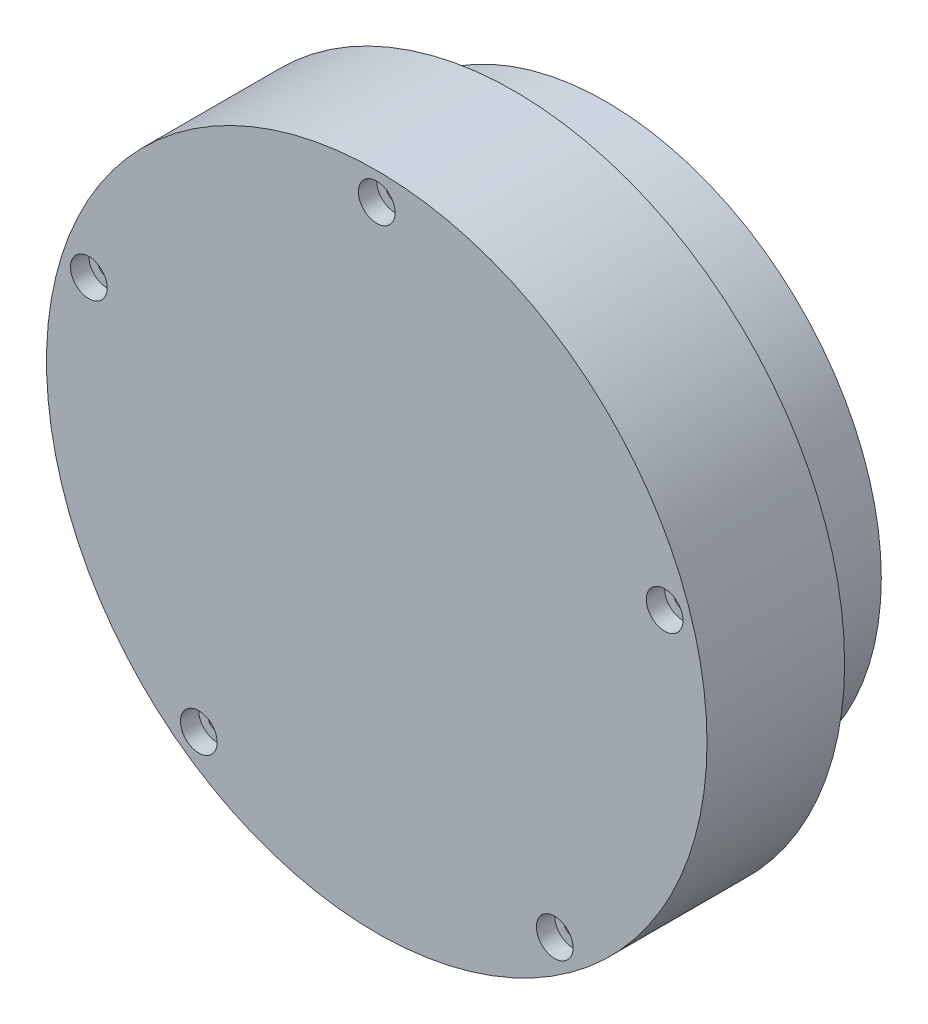
ISO-10303-21;
HEADER;
FILE_DESCRIPTION(('STEP AP214'),'2;1');
FILE_NAME('part.step','',(''),(''),'','','');
FILE_SCHEMA(('AUTOMOTIVE_DESIGN { 1 0 10303 214 1 1 1 1 }'));
ENDSEC;
DATA;
#1=APPLICATION_CONTEXT('core data for automotive mechanical design processes');
#2=APPLICATION_PROTOCOL_DEFINITION('international standard','automotive_design',2000,#1);
#3=PRODUCT_CONTEXT('',#1,'mechanical');
#4=PRODUCT('Part','Part','',(#3));
#5=PRODUCT_RELATED_PRODUCT_CATEGORY('part','',(#4));
#6=PRODUCT_DEFINITION_FORMATION('','',#4);
#7=PRODUCT_DEFINITION_CONTEXT('part definition',#1,'design');
#8=PRODUCT_DEFINITION('design','',#6,#7);
#9=PRODUCT_DEFINITION_SHAPE('','',#8);
#10=(LENGTH_UNIT() NAMED_UNIT(*) SI_UNIT(.MILLI.,.METRE.));
#11=(NAMED_UNIT(*) PLANE_ANGLE_UNIT() SI_UNIT($,.RADIAN.));
#12=(NAMED_UNIT(*) SI_UNIT($,.STERADIAN.) SOLID_ANGLE_UNIT());
#13=UNCERTAINTY_MEASURE_WITH_UNIT(LENGTH_MEASURE(1.E-05),#10,'distance_accuracy_value','');
#14=(GEOMETRIC_REPRESENTATION_CONTEXT(3) GLOBAL_UNCERTAINTY_ASSIGNED_CONTEXT((#13)) GLOBAL_UNIT_ASSIGNED_CONTEXT((#10,
#11,#12)) REPRESENTATION_CONTEXT('',''));
#15=CARTESIAN_POINT('',(0.,0.,0.));
#16=DIRECTION('',(0.,0.,1.));
#17=DIRECTION('',(1.,0.,0.));
#18=AXIS2_PLACEMENT_3D('',#15,#16,#17);
#19=CARTESIAN_POINT('',(0.,41.91,5.94045602605863));
#20=DIRECTION('',(0.,0.,1.));
#21=DIRECTION('',(1.,0.,0.));
#22=AXIS2_PLACEMENT_3D('',#19,#20,#21);
#23=CYLINDRICAL_SURFACE('',#22,1.27);
#24=CARTESIAN_POINT('',(0.,41.91,14.8304560260586));
#25=DIRECTION('',(0.,0.,-1.));
#26=DIRECTION('',(-1.,0.,0.));
#27=AXIS2_PLACEMENT_3D('',#24,#25,#26);
#28=CIRCLE('',#27,1.27);
#29=CARTESIAN_POINT('',(-1.27,41.91,14.8304560260586));
#30=VERTEX_POINT('',#29);
#31=EDGE_CURVE('E52',#30,#30,#28,.T.);
#32=ORIENTED_EDGE('',*,*,#31,.T.);
#33=EDGE_LOOP('',(#32));
#34=FACE_BOUND('',#33,.T.);
#35=CARTESIAN_POINT('',(0.,41.91,31.3404560260586));
#36=DIRECTION('',(0.,0.,1.));
#37=DIRECTION('',(1.,0.,0.));
#38=AXIS2_PLACEMENT_3D('',#35,#36,#37);
#39=CIRCLE('',#38,1.27);
#40=CARTESIAN_POINT('',(1.27,41.91,31.3404560260586));
#41=VERTEX_POINT('',#40);
#42=EDGE_CURVE('E41',#41,#41,#39,.F.);
#43=ORIENTED_EDGE('',*,*,#42,.F.);
#44=EDGE_LOOP('',(#43));
#45=FACE_BOUND('',#44,.T.);
#46=ADVANCED_FACE('F40',(#34,#45),#23,.F.);
#47=CARTESIAN_POINT('',(0.,0.,33.8804560260586));
#48=DIRECTION('',(0.,0.,1.));
#49=DIRECTION('',(1.,0.,0.));
#50=AXIS2_PLACEMENT_3D('',#47,#48,#49);
#51=PLANE('',#50);
#52=CARTESIAN_POINT('',(-39.8587785979299,12.9509022342539,33.8804560260586));
#53=DIRECTION('',(0.,0.,1.));
#54=DIRECTION('',(0.309016994374945,0.951056516295155,0.));
#55=AXIS2_PLACEMENT_3D('',#52,#53,#54);
#56=CIRCLE('',#55,2.54);
#57=CARTESIAN_POINT('',(-39.0738754322176,15.3665857856436,33.8804560260586));
#58=VERTEX_POINT('',#57);
#59=EDGE_CURVE('E167',#58,#58,#56,.T.);
#60=ORIENTED_EDGE('',*,*,#59,.F.);
#61=EDGE_LOOP('',(#60));
#62=FACE_BOUND('',#61,.T.);
#63=CARTESIAN_POINT('',(-24.6340799235774,-33.9059022342542,33.8804560260586));
#64=DIRECTION('',(0.,0.,1.));
#65=DIRECTION('',(-0.809016994374951,0.587785252292469,0.));
#66=AXIS2_PLACEMENT_3D('',#63,#64,#65);
#67=CIRCLE('',#66,2.54);
#68=CARTESIAN_POINT('',(-26.6889830892897,-32.4129276934313,33.8804560260586));
#69=VERTEX_POINT('',#68);
#70=EDGE_CURVE('E175',#69,#69,#67,.T.);
#71=ORIENTED_EDGE('',*,*,#70,.F.);
#72=EDGE_LOOP('',(#71));
#73=FACE_BOUND('',#72,.T.);
#74=CARTESIAN_POINT('',(24.6340799235778,-33.9059022342538,33.8804560260586));
#75=DIRECTION('',(0.,0.,1.));
#76=DIRECTION('',(-0.809016994374942,-0.58778525229248,0.));
#77=AXIS2_PLACEMENT_3D('',#74,#75,#76);
#78=CIRCLE('',#77,2.54);
#79=CARTESIAN_POINT('',(22.5791767578655,-35.3988767750767,33.8804560260586));
#80=VERTEX_POINT('',#79);
#81=EDGE_CURVE('E180',#80,#80,#78,.T.);
#82=ORIENTED_EDGE('',*,*,#81,.F.);
#83=EDGE_LOOP('',(#82));
#84=FACE_BOUND('',#83,.T.);
#85=CARTESIAN_POINT('',(39.8587785979297,12.9509022342545,33.8804560260586));
#86=DIRECTION('',(0.,0.,1.));
#87=DIRECTION('',(0.309016994374958,-0.95105651629515,0.));
#88=AXIS2_PLACEMENT_3D('',#85,#86,#87);
#89=CIRCLE('',#88,2.54);
#90=CARTESIAN_POINT('',(40.6436817636421,10.5352186828648,33.8804560260586));
#91=VERTEX_POINT('',#90);
#92=EDGE_CURVE('E184',#91,#91,#89,.T.);
#93=ORIENTED_EDGE('',*,*,#92,.F.);
#94=EDGE_LOOP('',(#93));
#95=FACE_BOUND('',#94,.T.);
#96=CARTESIAN_POINT('',(0.,41.91,33.8804560260586));
#97=DIRECTION('',(0.,0.,1.));
#98=DIRECTION('',(1.,0.,0.));
#99=AXIS2_PLACEMENT_3D('',#96,#97,#98);
#100=CIRCLE('',#99,2.54);
#101=CARTESIAN_POINT('',(2.54,41.91,33.8804560260586));
#102=VERTEX_POINT('',#101);
#103=EDGE_CURVE('E62',#102,#102,#100,.T.);
#104=ORIENTED_EDGE('',*,*,#103,.F.);
#105=EDGE_LOOP('',(#104));
#106=FACE_BOUND('',#105,.T.);
#107=CARTESIAN_POINT('',(0.,0.,33.8804560260586));
#108=DIRECTION('',(0.,0.,1.));
#109=DIRECTION('',(1.,0.,0.));
#110=AXIS2_PLACEMENT_3D('',#107,#108,#109);
#111=CIRCLE('',#110,45.72);
#112=CARTESIAN_POINT('',(45.72,0.,33.8804560260586));
#113=VERTEX_POINT('',#112);
#114=EDGE_CURVE('E10',#113,#113,#111,.T.);
#115=ORIENTED_EDGE('',*,*,#114,.T.);
#116=EDGE_LOOP('',(#115));
#117=FACE_BOUND('',#116,.T.);
#118=ADVANCED_FACE('F39',(#62,#73,#84,#95,#106,#117),#51,.T.);
#119=CARTESIAN_POINT('',(0.,0.,48.9591205211727));
#120=DIRECTION('',(0.,0.,1.));
#121=DIRECTION('',(1.,0.,0.));
#122=AXIS2_PLACEMENT_3D('',#119,#120,#121);
#123=CYLINDRICAL_SURFACE('',#122,45.72);
#124=CARTESIAN_POINT('',(0.,0.,14.8304560260586));
#125=DIRECTION('',(0.,0.,1.));
#126=DIRECTION('',(1.,0.,0.));
#127=AXIS2_PLACEMENT_3D('',#124,#125,#126);
#128=CIRCLE('',#127,45.72);
#129=CARTESIAN_POINT('',(45.72,0.,14.8304560260586));
#130=VERTEX_POINT('',#129);
#131=EDGE_CURVE('E44',#130,#130,#128,.T.);
#132=ORIENTED_EDGE('',*,*,#131,.T.);
#133=EDGE_LOOP('',(#132));
#134=FACE_BOUND('',#133,.T.);
#135=ORIENTED_EDGE('',*,*,#114,.F.);
#136=EDGE_LOOP('',(#135));
#137=FACE_BOUND('',#136,.T.);
#138=ADVANCED_FACE('F94',(#134,#137),#123,.T.);
#139=CARTESIAN_POINT('',(0.,-45.72,14.8304560260586));
#140=DIRECTION('',(0.,0.,-1.));
#141=DIRECTION('',(-1.,0.,0.));
#142=AXIS2_PLACEMENT_3D('',#139,#140,#141);
#143=PLANE('',#142);
#144=CARTESIAN_POINT('',(-39.8587785979299,12.9509022342539,14.8304560260586));
#145=DIRECTION('',(0.,0.,-1.));
#146=DIRECTION('',(-0.309016994374945,-0.951056516295155,0.));
#147=AXIS2_PLACEMENT_3D('',#144,#145,#146);
#148=CIRCLE('',#147,1.27);
#149=CARTESIAN_POINT('',(-40.2512301807861,11.7430604585591,14.8304560260586));
#150=VERTEX_POINT('',#149);
#151=EDGE_CURVE('E68',#150,#150,#148,.T.);
#152=ORIENTED_EDGE('',*,*,#151,.F.);
#153=EDGE_LOOP('',(#152));
#154=FACE_BOUND('',#153,.T.);
#155=CARTESIAN_POINT('',(-24.6340799235774,-33.9059022342542,14.8304560260586));
#156=DIRECTION('',(0.,0.,-1.));
#157=DIRECTION('',(0.809016994374951,-0.587785252292469,0.));
#158=AXIS2_PLACEMENT_3D('',#155,#156,#157);
#159=CIRCLE('',#158,1.27);
#160=CARTESIAN_POINT('',(-23.6066283407212,-34.6523895046656,14.8304560260586));
#161=VERTEX_POINT('',#160);
#162=EDGE_CURVE('E205',#161,#161,#159,.T.);
#163=ORIENTED_EDGE('',*,*,#162,.F.);
#164=EDGE_LOOP('',(#163));
#165=FACE_BOUND('',#164,.T.);
#166=CARTESIAN_POINT('',(24.6340799235778,-33.9059022342538,14.8304560260586));
#167=DIRECTION('',(0.,0.,-1.));
#168=DIRECTION('',(0.809016994374942,0.58778525229248,0.));
#169=AXIS2_PLACEMENT_3D('',#166,#167,#168);
#170=CIRCLE('',#169,1.27);
#171=CARTESIAN_POINT('',(25.661531506434,-33.1594149638424,14.8304560260586));
#172=VERTEX_POINT('',#171);
#173=EDGE_CURVE('E204',#172,#172,#170,.T.);
#174=ORIENTED_EDGE('',*,*,#173,.F.);
#175=EDGE_LOOP('',(#174));
#176=FACE_BOUND('',#175,.T.);
#177=CARTESIAN_POINT('',(39.8587785979297,12.9509022342545,14.8304560260586));
#178=DIRECTION('',(0.,0.,-1.));
#179=DIRECTION('',(-0.309016994374958,0.95105651629515,0.));
#180=AXIS2_PLACEMENT_3D('',#177,#178,#179);
#181=CIRCLE('',#180,1.27);
#182=CARTESIAN_POINT('',(39.4663270150735,14.1587440099493,14.8304560260586));
#183=VERTEX_POINT('',#182);
#184=EDGE_CURVE('E71',#183,#183,#181,.T.);
#185=ORIENTED_EDGE('',*,*,#184,.F.);
#186=EDGE_LOOP('',(#185));
#187=FACE_BOUND('',#186,.T.);
#188=ORIENTED_EDGE('',*,*,#31,.F.);
#189=EDGE_LOOP('',(#188));
#190=FACE_BOUND('',#189,.T.);
#191=CARTESIAN_POINT('',(0.,0.,14.8304560260586));
#192=DIRECTION('',(0.,0.,1.));
#193=DIRECTION('',(1.,0.,0.));
#194=AXIS2_PLACEMENT_3D('',#191,#192,#193);
#195=CIRCLE('',#194,38.1);
#196=CARTESIAN_POINT('',(38.1,0.,14.8304560260586));
#197=VERTEX_POINT('',#196);
#198=EDGE_CURVE('E49',#197,#197,#195,.T.);
#199=ORIENTED_EDGE('',*,*,#198,.T.);
#200=EDGE_LOOP('',(#199));
#201=FACE_BOUND('',#200,.T.);
#202=ORIENTED_EDGE('',*,*,#131,.F.);
#203=EDGE_LOOP('',(#202));
#204=FACE_BOUND('',#203,.T.);
#205=ADVANCED_FACE('F76',(#154,#165,#176,#187,#190,#201,#204),#143,.T.);
#206=CARTESIAN_POINT('',(0.,0.,48.9591205211727));
#207=DIRECTION('',(0.,0.,1.));
#208=DIRECTION('',(1.,0.,0.));
#209=AXIS2_PLACEMENT_3D('',#206,#207,#208);
#210=CYLINDRICAL_SURFACE('',#209,38.1);
#211=CARTESIAN_POINT('',(0.,0.,2.13045602605864));
#212=DIRECTION('',(0.,0.,1.));
#213=DIRECTION('',(1.,0.,0.));
#214=AXIS2_PLACEMENT_3D('',#211,#212,#213);
#215=CIRCLE('',#214,38.1);
#216=CARTESIAN_POINT('',(38.1,0.,2.13045602605864));
#217=VERTEX_POINT('',#216);
#218=EDGE_CURVE('E54',#217,#217,#215,.T.);
#219=ORIENTED_EDGE('',*,*,#218,.T.);
#220=EDGE_LOOP('',(#219));
#221=FACE_BOUND('',#220,.T.);
#222=ORIENTED_EDGE('',*,*,#198,.F.);
#223=EDGE_LOOP('',(#222));
#224=FACE_BOUND('',#223,.T.);
#225=ADVANCED_FACE('F82',(#221,#224),#210,.T.);
#226=CARTESIAN_POINT('',(0.,-38.1,2.13045602605864));
#227=DIRECTION('',(0.,0.,-1.));
#228=DIRECTION('',(-1.,0.,0.));
#229=AXIS2_PLACEMENT_3D('',#226,#227,#228);
#230=PLANE('',#229);
#231=ORIENTED_EDGE('',*,*,#218,.F.);
#232=EDGE_LOOP('',(#231));
#233=FACE_BOUND('',#232,.T.);
#234=ADVANCED_FACE('F85',(#233),#230,.T.);
#235=CARTESIAN_POINT('',(0.,41.91,31.3404560260586));
#236=DIRECTION('',(0.,0.,1.));
#237=DIRECTION('',(1.,0.,0.));
#238=AXIS2_PLACEMENT_3D('',#235,#236,#237);
#239=PLANE('',#238);
#240=CARTESIAN_POINT('',(0.,41.91,31.3404560260586));
#241=DIRECTION('',(0.,0.,1.));
#242=DIRECTION('',(1.,0.,0.));
#243=AXIS2_PLACEMENT_3D('',#240,#241,#242);
#244=CIRCLE('',#243,2.54);
#245=CARTESIAN_POINT('',(2.54,41.91,31.3404560260586));
#246=VERTEX_POINT('',#245);
#247=EDGE_CURVE('E63',#246,#246,#244,.T.);
#248=ORIENTED_EDGE('',*,*,#247,.T.);
#249=EDGE_LOOP('',(#248));
#250=FACE_BOUND('',#249,.T.);
#251=ORIENTED_EDGE('',*,*,#42,.T.);
#252=EDGE_LOOP('',(#251));
#253=FACE_BOUND('',#252,.T.);
#254=ADVANCED_FACE('F89',(#250,#253),#239,.T.);
#255=CARTESIAN_POINT('',(0.,41.91,31.3404560260586));
#256=DIRECTION('',(0.,0.,1.));
#257=DIRECTION('',(1.,0.,0.));
#258=AXIS2_PLACEMENT_3D('',#255,#256,#257);
#259=CYLINDRICAL_SURFACE('',#258,2.54);
#260=ORIENTED_EDGE('',*,*,#247,.F.);
#261=EDGE_LOOP('',(#260));
#262=FACE_BOUND('',#261,.T.);
#263=ORIENTED_EDGE('',*,*,#103,.T.);
#264=EDGE_LOOP('',(#263));
#265=FACE_BOUND('',#264,.T.);
#266=ADVANCED_FACE('F106',(#262,#265),#259,.F.);
#267=CARTESIAN_POINT('',(39.8587785979297,12.9509022342545,5.94045602605863));
#268=DIRECTION('',(0.,0.,1.));
#269=DIRECTION('',(0.309016994374958,-0.95105651629515,0.));
#270=AXIS2_PLACEMENT_3D('',#267,#268,#269);
#271=CYLINDRICAL_SURFACE('',#270,1.27);
#272=ORIENTED_EDGE('',*,*,#184,.T.);
#273=EDGE_LOOP('',(#272));
#274=FACE_BOUND('',#273,.T.);
#275=CARTESIAN_POINT('',(39.8587785979297,12.9509022342545,31.3404560260586));
#276=DIRECTION('',(0.,0.,1.));
#277=DIRECTION('',(1.,0.,0.));
#278=AXIS2_PLACEMENT_3D('',#275,#276,#277);
#279=CIRCLE('',#278,1.27);
#280=CARTESIAN_POINT('',(41.1287785979297,12.9509022342545,31.3404560260586));
#281=VERTEX_POINT('',#280);
#282=EDGE_CURVE('E197',#281,#281,#279,.F.);
#283=ORIENTED_EDGE('',*,*,#282,.F.);
#284=EDGE_LOOP('',(#283));
#285=FACE_BOUND('',#284,.T.);
#286=ADVANCED_FACE('F108',(#274,#285),#271,.F.);
#287=CARTESIAN_POINT('',(24.6340799235778,-33.9059022342538,5.94045602605863));
#288=DIRECTION('',(0.,0.,1.));
#289=DIRECTION('',(-0.809016994374942,-0.58778525229248,0.));
#290=AXIS2_PLACEMENT_3D('',#287,#288,#289);
#291=CYLINDRICAL_SURFACE('',#290,1.27);
#292=ORIENTED_EDGE('',*,*,#173,.T.);
#293=EDGE_LOOP('',(#292));
#294=FACE_BOUND('',#293,.T.);
#295=CARTESIAN_POINT('',(24.6340799235778,-33.9059022342538,31.3404560260586));
#296=DIRECTION('',(0.,0.,1.));
#297=DIRECTION('',(1.,0.,0.));
#298=AXIS2_PLACEMENT_3D('',#295,#296,#297);
#299=CIRCLE('',#298,1.27);
#300=CARTESIAN_POINT('',(25.9040799235778,-33.9059022342538,31.3404560260586));
#301=VERTEX_POINT('',#300);
#302=EDGE_CURVE('E191',#301,#301,#299,.F.);
#303=ORIENTED_EDGE('',*,*,#302,.F.);
#304=EDGE_LOOP('',(#303));
#305=FACE_BOUND('',#304,.T.);
#306=ADVANCED_FACE('F111',(#294,#305),#291,.F.);
#307=CARTESIAN_POINT('',(-24.6340799235774,-33.9059022342542,5.94045602605863));
#308=DIRECTION('',(0.,0.,1.));
#309=DIRECTION('',(-0.809016994374951,0.587785252292469,0.));
#310=AXIS2_PLACEMENT_3D('',#307,#308,#309);
#311=CYLINDRICAL_SURFACE('',#310,1.27);
#312=ORIENTED_EDGE('',*,*,#162,.T.);
#313=EDGE_LOOP('',(#312));
#314=FACE_BOUND('',#313,.T.);
#315=CARTESIAN_POINT('',(-24.6340799235774,-33.9059022342542,31.3404560260586));
#316=DIRECTION('',(0.,0.,1.));
#317=DIRECTION('',(1.,0.,0.));
#318=AXIS2_PLACEMENT_3D('',#315,#316,#317);
#319=CIRCLE('',#318,1.27);
#320=CARTESIAN_POINT('',(-23.3640799235774,-33.9059022342542,31.3404560260586));
#321=VERTEX_POINT('',#320);
#322=EDGE_CURVE('E192',#321,#321,#319,.F.);
#323=ORIENTED_EDGE('',*,*,#322,.F.);
#324=EDGE_LOOP('',(#323));
#325=FACE_BOUND('',#324,.T.);
#326=ADVANCED_FACE('F116',(#314,#325),#311,.F.);
#327=CARTESIAN_POINT('',(-39.8587785979299,12.9509022342539,5.94045602605863));
#328=DIRECTION('',(0.,0.,1.));
#329=DIRECTION('',(0.309016994374945,0.951056516295155,0.));
#330=AXIS2_PLACEMENT_3D('',#327,#328,#329);
#331=CYLINDRICAL_SURFACE('',#330,1.27);
#332=ORIENTED_EDGE('',*,*,#151,.T.);
#333=EDGE_LOOP('',(#332));
#334=FACE_BOUND('',#333,.T.);
#335=CARTESIAN_POINT('',(-39.8587785979299,12.9509022342539,31.3404560260586));
#336=DIRECTION('',(0.,0.,1.));
#337=DIRECTION('',(1.,0.,0.));
#338=AXIS2_PLACEMENT_3D('',#335,#336,#337);
#339=CIRCLE('',#338,1.27);
#340=CARTESIAN_POINT('',(-38.5887785979299,12.9509022342539,31.3404560260586));
#341=VERTEX_POINT('',#340);
#342=EDGE_CURVE('E166',#341,#341,#339,.F.);
#343=ORIENTED_EDGE('',*,*,#342,.F.);
#344=EDGE_LOOP('',(#343));
#345=FACE_BOUND('',#344,.T.);
#346=ADVANCED_FACE('F124',(#334,#345),#331,.F.);
#347=CARTESIAN_POINT('',(-39.8587785979299,12.9509022342539,31.3404560260586));
#348=DIRECTION('',(0.,0.,1.));
#349=DIRECTION('',(0.309016994374945,0.951056516295155,0.));
#350=AXIS2_PLACEMENT_3D('',#347,#348,#349);
#351=PLANE('',#350);
#352=CARTESIAN_POINT('',(-39.8587785979299,12.9509022342539,31.3404560260586));
#353=DIRECTION('',(0.,0.,1.));
#354=DIRECTION('',(0.309016994374945,0.951056516295155,0.));
#355=AXIS2_PLACEMENT_3D('',#352,#353,#354);
#356=CIRCLE('',#355,2.54);
#357=CARTESIAN_POINT('',(-39.0738754322176,15.3665857856436,31.3404560260586));
#358=VERTEX_POINT('',#357);
#359=EDGE_CURVE('E162',#358,#358,#356,.T.);
#360=ORIENTED_EDGE('',*,*,#359,.T.);
#361=EDGE_LOOP('',(#360));
#362=FACE_BOUND('',#361,.T.);
#363=ORIENTED_EDGE('',*,*,#342,.T.);
#364=EDGE_LOOP('',(#363));
#365=FACE_BOUND('',#364,.T.);
#366=ADVANCED_FACE('F127',(#362,#365),#351,.T.);
#367=CARTESIAN_POINT('',(-39.8587785979299,12.9509022342539,31.3404560260586));
#368=DIRECTION('',(0.,0.,1.));
#369=DIRECTION('',(0.309016994374945,0.951056516295155,0.));
#370=AXIS2_PLACEMENT_3D('',#367,#368,#369);
#371=CYLINDRICAL_SURFACE('',#370,2.54);
#372=ORIENTED_EDGE('',*,*,#359,.F.);
#373=EDGE_LOOP('',(#372));
#374=FACE_BOUND('',#373,.T.);
#375=ORIENTED_EDGE('',*,*,#59,.T.);
#376=EDGE_LOOP('',(#375));
#377=FACE_BOUND('',#376,.T.);
#378=ADVANCED_FACE('F146',(#374,#377),#371,.F.);
#379=CARTESIAN_POINT('',(-24.6340799235774,-33.9059022342542,31.3404560260586));
#380=DIRECTION('',(0.,0.,1.));
#381=DIRECTION('',(-0.809016994374951,0.587785252292469,0.));
#382=AXIS2_PLACEMENT_3D('',#379,#380,#381);
#383=PLANE('',#382);
#384=CARTESIAN_POINT('',(-24.6340799235774,-33.9059022342542,31.3404560260586));
#385=DIRECTION('',(0.,0.,1.));
#386=DIRECTION('',(-0.809016994374951,0.587785252292469,0.));
#387=AXIS2_PLACEMENT_3D('',#384,#385,#386);
#388=CIRCLE('',#387,2.54);
#389=CARTESIAN_POINT('',(-26.6889830892897,-32.4129276934313,31.3404560260586));
#390=VERTEX_POINT('',#389);
#391=EDGE_CURVE('E170',#390,#390,#388,.T.);
#392=ORIENTED_EDGE('',*,*,#391,.T.);
#393=EDGE_LOOP('',(#392));
#394=FACE_BOUND('',#393,.T.);
#395=ORIENTED_EDGE('',*,*,#322,.T.);
#396=EDGE_LOOP('',(#395));
#397=FACE_BOUND('',#396,.T.);
#398=ADVANCED_FACE('F144',(#394,#397),#383,.T.);
#399=CARTESIAN_POINT('',(-24.6340799235774,-33.9059022342542,31.3404560260586));
#400=DIRECTION('',(0.,0.,1.));
#401=DIRECTION('',(-0.809016994374951,0.587785252292469,0.));
#402=AXIS2_PLACEMENT_3D('',#399,#400,#401);
#403=CYLINDRICAL_SURFACE('',#402,2.54);
#404=ORIENTED_EDGE('',*,*,#391,.F.);
#405=EDGE_LOOP('',(#404));
#406=FACE_BOUND('',#405,.T.);
#407=ORIENTED_EDGE('',*,*,#70,.T.);
#408=EDGE_LOOP('',(#407));
#409=FACE_BOUND('',#408,.T.);
#410=ADVANCED_FACE('F138',(#406,#409),#403,.F.);
#411=CARTESIAN_POINT('',(24.6340799235778,-33.9059022342538,31.3404560260586));
#412=DIRECTION('',(0.,0.,1.));
#413=DIRECTION('',(-0.809016994374942,-0.58778525229248,0.));
#414=AXIS2_PLACEMENT_3D('',#411,#412,#413);
#415=PLANE('',#414);
#416=CARTESIAN_POINT('',(24.6340799235778,-33.9059022342538,31.3404560260586));
#417=DIRECTION('',(0.,0.,1.));
#418=DIRECTION('',(-0.809016994374942,-0.58778525229248,0.));
#419=AXIS2_PLACEMENT_3D('',#416,#417,#418);
#420=CIRCLE('',#419,2.54);
#421=CARTESIAN_POINT('',(22.5791767578655,-35.3988767750767,31.3404560260586));
#422=VERTEX_POINT('',#421);
#423=EDGE_CURVE('E177',#422,#422,#420,.T.);
#424=ORIENTED_EDGE('',*,*,#423,.T.);
#425=EDGE_LOOP('',(#424));
#426=FACE_BOUND('',#425,.T.);
#427=ORIENTED_EDGE('',*,*,#302,.T.);
#428=EDGE_LOOP('',(#427));
#429=FACE_BOUND('',#428,.T.);
#430=ADVANCED_FACE('F139',(#426,#429),#415,.T.);
#431=CARTESIAN_POINT('',(24.6340799235778,-33.9059022342538,31.3404560260586));
#432=DIRECTION('',(0.,0.,1.));
#433=DIRECTION('',(-0.809016994374942,-0.58778525229248,0.));
#434=AXIS2_PLACEMENT_3D('',#431,#432,#433);
#435=CYLINDRICAL_SURFACE('',#434,2.54);
#436=ORIENTED_EDGE('',*,*,#423,.F.);
#437=EDGE_LOOP('',(#436));
#438=FACE_BOUND('',#437,.T.);
#439=ORIENTED_EDGE('',*,*,#81,.T.);
#440=EDGE_LOOP('',(#439));
#441=FACE_BOUND('',#440,.T.);
#442=ADVANCED_FACE('F135',(#438,#441),#435,.F.);
#443=CARTESIAN_POINT('',(39.8587785979297,12.9509022342545,31.3404560260586));
#444=DIRECTION('',(0.,0.,1.));
#445=DIRECTION('',(0.309016994374958,-0.95105651629515,0.));
#446=AXIS2_PLACEMENT_3D('',#443,#444,#445);
#447=PLANE('',#446);
#448=CARTESIAN_POINT('',(39.8587785979297,12.9509022342545,31.3404560260586));
#449=DIRECTION('',(0.,0.,1.));
#450=DIRECTION('',(0.309016994374958,-0.95105651629515,0.));
#451=AXIS2_PLACEMENT_3D('',#448,#449,#450);
#452=CIRCLE('',#451,2.54);
#453=CARTESIAN_POINT('',(40.6436817636421,10.5352186828648,31.3404560260586));
#454=VERTEX_POINT('',#453);
#455=EDGE_CURVE('E182',#454,#454,#452,.T.);
#456=ORIENTED_EDGE('',*,*,#455,.T.);
#457=EDGE_LOOP('',(#456));
#458=FACE_BOUND('',#457,.T.);
#459=ORIENTED_EDGE('',*,*,#282,.T.);
#460=EDGE_LOOP('',(#459));
#461=FACE_BOUND('',#460,.T.);
#462=ADVANCED_FACE('F126',(#458,#461),#447,.T.);
#463=CARTESIAN_POINT('',(39.8587785979297,12.9509022342545,31.3404560260586));
#464=DIRECTION('',(0.,0.,1.));
#465=DIRECTION('',(0.309016994374958,-0.95105651629515,0.));
#466=AXIS2_PLACEMENT_3D('',#463,#464,#465);
#467=CYLINDRICAL_SURFACE('',#466,2.54);
#468=ORIENTED_EDGE('',*,*,#455,.F.);
#469=EDGE_LOOP('',(#468));
#470=FACE_BOUND('',#469,.T.);
#471=ORIENTED_EDGE('',*,*,#92,.T.);
#472=EDGE_LOOP('',(#471));
#473=FACE_BOUND('',#472,.T.);
#474=ADVANCED_FACE('F133',(#470,#473),#467,.F.);
#475=CLOSED_SHELL('',(#46,#118,#138,#205,#225,#234,#254,#266,#286,#306,#326,#346,#366,#378,#398,
#410,#430,#442,#462,#474));
#476=MANIFOLD_SOLID_BREP('B2',#475);
#477=ADVANCED_BREP_SHAPE_REPRESENTATION('',(#18,#476),#14);
#478=SHAPE_DEFINITION_REPRESENTATION(#9,#477);
ENDSEC;
END-ISO-10303-21;
